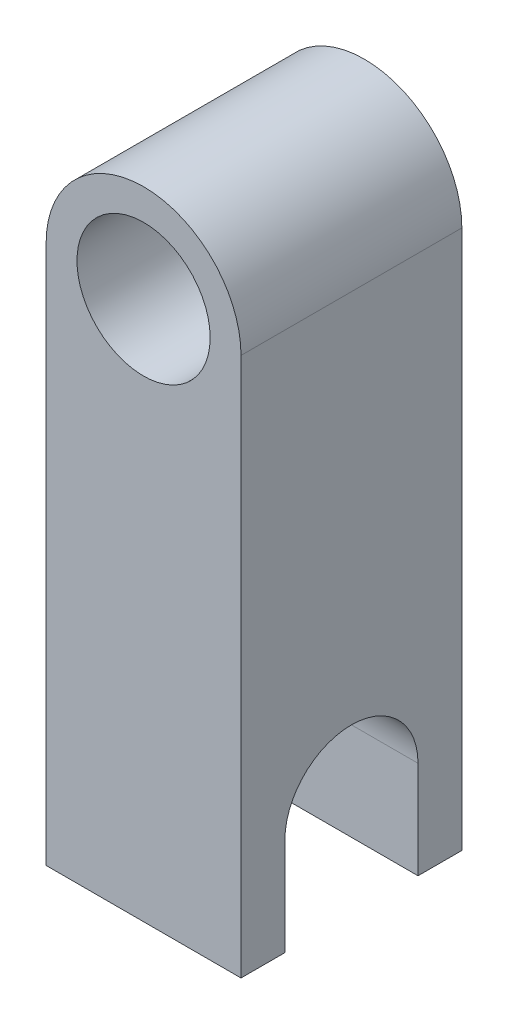
ISO-10303-21;
HEADER;
FILE_DESCRIPTION(('STEP AP214'),'2;1');
FILE_NAME('part.step','',(''),(''),'','','');
FILE_SCHEMA(('AUTOMOTIVE_DESIGN { 1 0 10303 214 1 1 1 1 }'));
ENDSEC;
DATA;
#1=APPLICATION_CONTEXT('core data for automotive mechanical design processes');
#2=APPLICATION_PROTOCOL_DEFINITION('international standard','automotive_design',2000,#1);
#3=PRODUCT_CONTEXT('',#1,'mechanical');
#4=PRODUCT('Part','Part','',(#3));
#5=PRODUCT_RELATED_PRODUCT_CATEGORY('part','',(#4));
#6=PRODUCT_DEFINITION_FORMATION('','',#4);
#7=PRODUCT_DEFINITION_CONTEXT('part definition',#1,'design');
#8=PRODUCT_DEFINITION('design','',#6,#7);
#9=PRODUCT_DEFINITION_SHAPE('','',#8);
#10=(LENGTH_UNIT() NAMED_UNIT(*) SI_UNIT(.MILLI.,.METRE.));
#11=(NAMED_UNIT(*) PLANE_ANGLE_UNIT() SI_UNIT($,.RADIAN.));
#12=(NAMED_UNIT(*) SI_UNIT($,.STERADIAN.) SOLID_ANGLE_UNIT());
#13=UNCERTAINTY_MEASURE_WITH_UNIT(LENGTH_MEASURE(1.E-05),#10,'distance_accuracy_value','');
#14=(GEOMETRIC_REPRESENTATION_CONTEXT(3) GLOBAL_UNCERTAINTY_ASSIGNED_CONTEXT((#13)) GLOBAL_UNIT_ASSIGNED_CONTEXT((#10,
#11,#12)) REPRESENTATION_CONTEXT('',''));
#15=CARTESIAN_POINT('',(0.,0.,0.));
#16=DIRECTION('',(0.,0.,1.));
#17=DIRECTION('',(1.,0.,0.));
#18=AXIS2_PLACEMENT_3D('',#15,#16,#17);
#19=CARTESIAN_POINT('',(15.,-83.,34.));
#20=DIRECTION('',(0.,-1.,0.));
#21=DIRECTION('',(1.,0.,0.));
#22=AXIS2_PLACEMENT_3D('',#19,#20,#21);
#23=PLANE('',#22);
#24=DIRECTION('',(-1.,0.,0.));
#25=VECTOR('',#24,1.);
#26=CARTESIAN_POINT('',(19.,-83.,6.75000000000001));
#27=LINE('',#26,#25);
#28=CARTESIAN_POINT('',(15.,-83.,6.75000000000001));
#29=VERTEX_POINT('',#28);
#30=CARTESIAN_POINT('',(-15.,-83.,6.75000000000001));
#31=VERTEX_POINT('',#30);
#32=EDGE_CURVE('E115',#29,#31,#27,.T.);
#33=ORIENTED_EDGE('',*,*,#32,.T.);
#34=DIRECTION('',(0.,0.,1.));
#35=VECTOR('',#34,1.);
#36=CARTESIAN_POINT('',(-15.,-83.,34.));
#37=LINE('',#36,#35);
#38=CARTESIAN_POINT('',(-15.,-83.,0.));
#39=VERTEX_POINT('',#38);
#40=EDGE_CURVE('E126',#39,#31,#37,.T.);
#41=ORIENTED_EDGE('',*,*,#40,.F.);
#42=DIRECTION('',(-1.,0.,0.));
#43=VECTOR('',#42,1.);
#44=CARTESIAN_POINT('',(15.,-83.,0.));
#45=LINE('',#44,#43);
#46=CARTESIAN_POINT('',(15.,-83.,0.));
#47=VERTEX_POINT('',#46);
#48=EDGE_CURVE('E152',#47,#39,#45,.T.);
#49=ORIENTED_EDGE('',*,*,#48,.F.);
#50=DIRECTION('',(0.,0.,1.));
#51=VECTOR('',#50,1.);
#52=CARTESIAN_POINT('',(15.,-83.,34.));
#53=LINE('',#52,#51);
#54=EDGE_CURVE('E128',#47,#29,#53,.T.);
#55=ORIENTED_EDGE('',*,*,#54,.T.);
#56=EDGE_LOOP('',(#33,#41,#49,#55));
#57=FACE_BOUND('',#56,.T.);
#58=ADVANCED_FACE('F49',(#57),#23,.T.);
#59=CARTESIAN_POINT('',(-15.,0.,34.));
#60=DIRECTION('',(1.,0.,0.));
#61=DIRECTION('',(0.,1.,0.));
#62=AXIS2_PLACEMENT_3D('',#59,#60,#61);
#63=PLANE('',#62);
#64=ORIENTED_EDGE('',*,*,#40,.T.);
#65=DIRECTION('',(0.,-1.,0.));
#66=VECTOR('',#65,1.);
#67=CARTESIAN_POINT('',(-15.,-68.,6.75000000000001));
#68=LINE('',#67,#66);
#69=CARTESIAN_POINT('',(-15.,-68.,6.75000000000001));
#70=VERTEX_POINT('',#69);
#71=EDGE_CURVE('E112',#70,#31,#68,.T.);
#72=ORIENTED_EDGE('',*,*,#71,.F.);
#73=CARTESIAN_POINT('',(-15.,-68.,17.));
#74=DIRECTION('',(-1.,0.,0.));
#75=DIRECTION('',(0.,-1.,0.));
#76=AXIS2_PLACEMENT_3D('',#73,#74,#75);
#77=CIRCLE('',#76,10.25);
#78=CARTESIAN_POINT('',(-15.,-68.,27.25));
#79=VERTEX_POINT('',#78);
#80=EDGE_CURVE('E201',#79,#70,#77,.T.);
#81=ORIENTED_EDGE('',*,*,#80,.F.);
#82=DIRECTION('',(0.,1.,0.));
#83=VECTOR('',#82,1.);
#84=CARTESIAN_POINT('',(-15.,-68.,27.25));
#85=LINE('',#84,#83);
#86=CARTESIAN_POINT('',(-15.,-83.,27.25));
#87=VERTEX_POINT('',#86);
#88=EDGE_CURVE('E65',#87,#79,#85,.T.);
#89=ORIENTED_EDGE('',*,*,#88,.F.);
#90=CARTESIAN_POINT('',(-15.,-83.,34.));
#91=VERTEX_POINT('',#90);
#92=EDGE_CURVE('E139',#87,#91,#37,.T.);
#93=ORIENTED_EDGE('',*,*,#92,.T.);
#94=DIRECTION('',(0.,-1.,0.));
#95=VECTOR('',#94,1.);
#96=CARTESIAN_POINT('',(-15.,0.,34.));
#97=LINE('',#96,#95);
#98=CARTESIAN_POINT('',(-15.,0.,34.));
#99=VERTEX_POINT('',#98);
#100=EDGE_CURVE('E159',#99,#91,#97,.T.);
#101=ORIENTED_EDGE('',*,*,#100,.F.);
#102=DIRECTION('',(0.,0.,-1.));
#103=VECTOR('',#102,1.);
#104=CARTESIAN_POINT('',(-15.,0.,34.));
#105=LINE('',#104,#103);
#106=CARTESIAN_POINT('',(-15.,0.,0.));
#107=VERTEX_POINT('',#106);
#108=EDGE_CURVE('E171',#99,#107,#105,.T.);
#109=ORIENTED_EDGE('',*,*,#108,.T.);
#110=DIRECTION('',(0.,-1.,0.));
#111=VECTOR('',#110,1.);
#112=CARTESIAN_POINT('',(-15.,0.,0.));
#113=LINE('',#112,#111);
#114=EDGE_CURVE('E136',#107,#39,#113,.T.);
#115=ORIENTED_EDGE('',*,*,#114,.T.);
#116=EDGE_LOOP('',(#64,#72,#81,#89,#93,#101,#109,#115));
#117=FACE_BOUND('',#116,.T.);
#118=ADVANCED_FACE('F133',(#117),#63,.F.);
#119=CARTESIAN_POINT('',(15.,0.,34.));
#120=DIRECTION('',(1.,0.,0.));
#121=DIRECTION('',(0.,1.,0.));
#122=AXIS2_PLACEMENT_3D('',#119,#120,#121);
#123=PLANE('',#122);
#124=DIRECTION('',(0.,1.,0.));
#125=VECTOR('',#124,1.);
#126=CARTESIAN_POINT('',(15.,0.,6.75000000000001));
#127=LINE('',#126,#125);
#128=CARTESIAN_POINT('',(15.,-68.,6.75000000000001));
#129=VERTEX_POINT('',#128);
#130=EDGE_CURVE('E73',#29,#129,#127,.T.);
#131=ORIENTED_EDGE('',*,*,#130,.F.);
#132=ORIENTED_EDGE('',*,*,#54,.F.);
#133=DIRECTION('',(0.,-1.,0.));
#134=VECTOR('',#133,1.);
#135=CARTESIAN_POINT('',(15.,0.,0.));
#136=LINE('',#135,#134);
#137=CARTESIAN_POINT('',(15.,0.,0.));
#138=VERTEX_POINT('',#137);
#139=EDGE_CURVE('E177',#138,#47,#136,.T.);
#140=ORIENTED_EDGE('',*,*,#139,.F.);
#141=DIRECTION('',(0.,0.,-1.));
#142=VECTOR('',#141,1.);
#143=CARTESIAN_POINT('',(15.,0.,34.));
#144=LINE('',#143,#142);
#145=CARTESIAN_POINT('',(15.,0.,34.));
#146=VERTEX_POINT('',#145);
#147=EDGE_CURVE('E184',#146,#138,#144,.T.);
#148=ORIENTED_EDGE('',*,*,#147,.F.);
#149=DIRECTION('',(0.,-1.,0.));
#150=VECTOR('',#149,1.);
#151=CARTESIAN_POINT('',(15.,0.,34.));
#152=LINE('',#151,#150);
#153=CARTESIAN_POINT('',(15.,-83.,34.));
#154=VERTEX_POINT('',#153);
#155=EDGE_CURVE('E164',#146,#154,#152,.T.);
#156=ORIENTED_EDGE('',*,*,#155,.T.);
#157=CARTESIAN_POINT('',(15.,-83.,27.25));
#158=VERTEX_POINT('',#157);
#159=EDGE_CURVE('E138',#158,#154,#53,.T.);
#160=ORIENTED_EDGE('',*,*,#159,.F.);
#161=DIRECTION('',(0.,-1.,0.));
#162=VECTOR('',#161,1.);
#163=CARTESIAN_POINT('',(15.,0.,27.25));
#164=LINE('',#163,#162);
#165=CARTESIAN_POINT('',(15.,-68.,27.25));
#166=VERTEX_POINT('',#165);
#167=EDGE_CURVE('E189',#166,#158,#164,.T.);
#168=ORIENTED_EDGE('',*,*,#167,.F.);
#169=CARTESIAN_POINT('',(15.,-68.,17.));
#170=DIRECTION('',(-1.,0.,0.));
#171=DIRECTION('',(0.,-1.,0.));
#172=AXIS2_PLACEMENT_3D('',#169,#170,#171);
#173=CIRCLE('',#172,10.25);
#174=EDGE_CURVE('E144',#166,#129,#173,.T.);
#175=ORIENTED_EDGE('',*,*,#174,.T.);
#176=EDGE_LOOP('',(#131,#132,#140,#148,#156,#160,#168,#175));
#177=FACE_BOUND('',#176,.T.);
#178=ADVANCED_FACE('F196',(#177),#123,.T.);
#179=CARTESIAN_POINT('',(0.,0.,34.));
#180=DIRECTION('',(0.,0.,-1.));
#181=DIRECTION('',(-1.,0.,0.));
#182=AXIS2_PLACEMENT_3D('',#179,#180,#181);
#183=CYLINDRICAL_SURFACE('',#182,10.25);
#184=CARTESIAN_POINT('',(0.,0.,34.));
#185=DIRECTION('',(0.,0.,1.));
#186=DIRECTION('',(1.,0.,0.));
#187=AXIS2_PLACEMENT_3D('',#184,#185,#186);
#188=CIRCLE('',#187,10.25);
#189=CARTESIAN_POINT('',(10.25,0.,34.));
#190=VERTEX_POINT('',#189);
#191=EDGE_CURVE('E155',#190,#190,#188,.T.);
#192=ORIENTED_EDGE('',*,*,#191,.T.);
#193=EDGE_LOOP('',(#192));
#194=FACE_BOUND('',#193,.T.);
#195=CARTESIAN_POINT('',(0.,0.,0.));
#196=DIRECTION('',(0.,0.,1.));
#197=DIRECTION('',(1.,0.,0.));
#198=AXIS2_PLACEMENT_3D('',#195,#196,#197);
#199=CIRCLE('',#198,10.25);
#200=CARTESIAN_POINT('',(10.25,0.,0.));
#201=VERTEX_POINT('',#200);
#202=EDGE_CURVE('E151',#201,#201,#199,.T.);
#203=ORIENTED_EDGE('',*,*,#202,.F.);
#204=EDGE_LOOP('',(#203));
#205=FACE_BOUND('',#204,.T.);
#206=ADVANCED_FACE('F51',(#194,#205),#183,.F.);
#207=CARTESIAN_POINT('',(0.,0.,34.));
#208=DIRECTION('',(0.,0.,-1.));
#209=DIRECTION('',(-1.,0.,0.));
#210=AXIS2_PLACEMENT_3D('',#207,#208,#209);
#211=CYLINDRICAL_SURFACE('',#210,15.);
#212=CARTESIAN_POINT('',(0.,0.,0.));
#213=DIRECTION('',(0.,0.,1.));
#214=DIRECTION('',(1.,0.,0.));
#215=AXIS2_PLACEMENT_3D('',#212,#213,#214);
#216=CIRCLE('',#215,15.);
#217=EDGE_CURVE('E160',#138,#107,#216,.T.);
#218=ORIENTED_EDGE('',*,*,#217,.T.);
#219=ORIENTED_EDGE('',*,*,#108,.F.);
#220=CARTESIAN_POINT('',(0.,0.,34.));
#221=DIRECTION('',(0.,0.,1.));
#222=DIRECTION('',(1.,0.,0.));
#223=AXIS2_PLACEMENT_3D('',#220,#221,#222);
#224=CIRCLE('',#223,15.);
#225=EDGE_CURVE('E168',#146,#99,#224,.T.);
#226=ORIENTED_EDGE('',*,*,#225,.F.);
#227=ORIENTED_EDGE('',*,*,#147,.T.);
#228=EDGE_LOOP('',(#218,#219,#226,#227));
#229=FACE_BOUND('',#228,.T.);
#230=ADVANCED_FACE('F224',(#229),#211,.T.);
#231=CARTESIAN_POINT('',(0.,0.,34.));
#232=DIRECTION('',(0.,0.,1.));
#233=DIRECTION('',(1.,0.,0.));
#234=AXIS2_PLACEMENT_3D('',#231,#232,#233);
#235=PLANE('',#234);
#236=ORIENTED_EDGE('',*,*,#100,.T.);
#237=DIRECTION('',(-1.,0.,0.));
#238=VECTOR('',#237,1.);
#239=CARTESIAN_POINT('',(15.,-83.,34.));
#240=LINE('',#239,#238);
#241=EDGE_CURVE('E147',#154,#91,#240,.T.);
#242=ORIENTED_EDGE('',*,*,#241,.F.);
#243=ORIENTED_EDGE('',*,*,#155,.F.);
#244=ORIENTED_EDGE('',*,*,#225,.T.);
#245=EDGE_LOOP('',(#236,#242,#243,#244));
#246=FACE_BOUND('',#245,.T.);
#247=ORIENTED_EDGE('',*,*,#191,.F.);
#248=EDGE_LOOP('',(#247));
#249=FACE_BOUND('',#248,.T.);
#250=ADVANCED_FACE('F217',(#246,#249),#235,.T.);
#251=CARTESIAN_POINT('',(0.,0.,0.));
#252=DIRECTION('',(0.,0.,1.));
#253=DIRECTION('',(1.,0.,0.));
#254=AXIS2_PLACEMENT_3D('',#251,#252,#253);
#255=PLANE('',#254);
#256=ORIENTED_EDGE('',*,*,#202,.T.);
#257=EDGE_LOOP('',(#256));
#258=FACE_BOUND('',#257,.T.);
#259=ORIENTED_EDGE('',*,*,#139,.T.);
#260=ORIENTED_EDGE('',*,*,#48,.T.);
#261=ORIENTED_EDGE('',*,*,#114,.F.);
#262=ORIENTED_EDGE('',*,*,#217,.F.);
#263=EDGE_LOOP('',(#259,#260,#261,#262));
#264=FACE_BOUND('',#263,.T.);
#265=ADVANCED_FACE('F226',(#258,#264),#255,.F.);
#266=DIRECTION('',(-1.,0.,0.));
#267=VECTOR('',#266,1.);
#268=CARTESIAN_POINT('',(19.,-83.,27.25));
#269=LINE('',#268,#267);
#270=EDGE_CURVE('E130',#158,#87,#269,.T.);
#271=ORIENTED_EDGE('',*,*,#270,.F.);
#272=ORIENTED_EDGE('',*,*,#159,.T.);
#273=ORIENTED_EDGE('',*,*,#241,.T.);
#274=ORIENTED_EDGE('',*,*,#92,.F.);
#275=EDGE_LOOP('',(#271,#272,#273,#274));
#276=FACE_BOUND('',#275,.T.);
#277=ADVANCED_FACE('F213',(#276),#23,.T.);
#278=CARTESIAN_POINT('',(15.,-68.,17.));
#279=DIRECTION('',(-1.,0.,0.));
#280=DIRECTION('',(0.,-1.,0.));
#281=AXIS2_PLACEMENT_3D('',#278,#279,#280);
#282=CYLINDRICAL_SURFACE('',#281,10.25);
#283=ORIENTED_EDGE('',*,*,#80,.T.);
#284=DIRECTION('',(-1.,0.,0.));
#285=VECTOR('',#284,1.);
#286=CARTESIAN_POINT('',(15.,-68.,6.75000000000001));
#287=LINE('',#286,#285);
#288=EDGE_CURVE('E11',#70,#129,#287,.F.);
#289=ORIENTED_EDGE('',*,*,#288,.T.);
#290=ORIENTED_EDGE('',*,*,#174,.F.);
#291=DIRECTION('',(-1.,0.,0.));
#292=VECTOR('',#291,1.);
#293=CARTESIAN_POINT('',(15.,-68.,27.25));
#294=LINE('',#293,#292);
#295=EDGE_CURVE('E58',#79,#166,#294,.F.);
#296=ORIENTED_EDGE('',*,*,#295,.F.);
#297=EDGE_LOOP('',(#283,#289,#290,#296));
#298=FACE_BOUND('',#297,.T.);
#299=ADVANCED_FACE('F199',(#298),#282,.F.);
#300=CARTESIAN_POINT('',(19.,-68.,27.25));
#301=DIRECTION('',(0.,0.,1.));
#302=DIRECTION('',(1.,0.,0.));
#303=AXIS2_PLACEMENT_3D('',#300,#301,#302);
#304=PLANE('',#303);
#305=ORIENTED_EDGE('',*,*,#167,.T.);
#306=ORIENTED_EDGE('',*,*,#270,.T.);
#307=ORIENTED_EDGE('',*,*,#88,.T.);
#308=ORIENTED_EDGE('',*,*,#295,.T.);
#309=EDGE_LOOP('',(#305,#306,#307,#308));
#310=FACE_BOUND('',#309,.T.);
#311=ADVANCED_FACE('F188',(#310),#304,.F.);
#312=CARTESIAN_POINT('',(19.,-68.,6.75000000000001));
#313=DIRECTION('',(0.,0.,-1.));
#314=DIRECTION('',(-1.,0.,0.));
#315=AXIS2_PLACEMENT_3D('',#312,#313,#314);
#316=PLANE('',#315);
#317=ORIENTED_EDGE('',*,*,#130,.T.);
#318=ORIENTED_EDGE('',*,*,#288,.F.);
#319=ORIENTED_EDGE('',*,*,#71,.T.);
#320=ORIENTED_EDGE('',*,*,#32,.F.);
#321=EDGE_LOOP('',(#317,#318,#319,#320));
#322=FACE_BOUND('',#321,.T.);
#323=ADVANCED_FACE('F114',(#322),#316,.F.);
#324=CLOSED_SHELL('',(#58,#118,#178,#206,#230,#250,#265,#277,#299,#311,#323));
#325=MANIFOLD_SOLID_BREP('B2',#324);
#326=ADVANCED_BREP_SHAPE_REPRESENTATION('',(#18,#325),#14);
#327=SHAPE_DEFINITION_REPRESENTATION(#9,#326);
ENDSEC;
END-ISO-10303-21;
